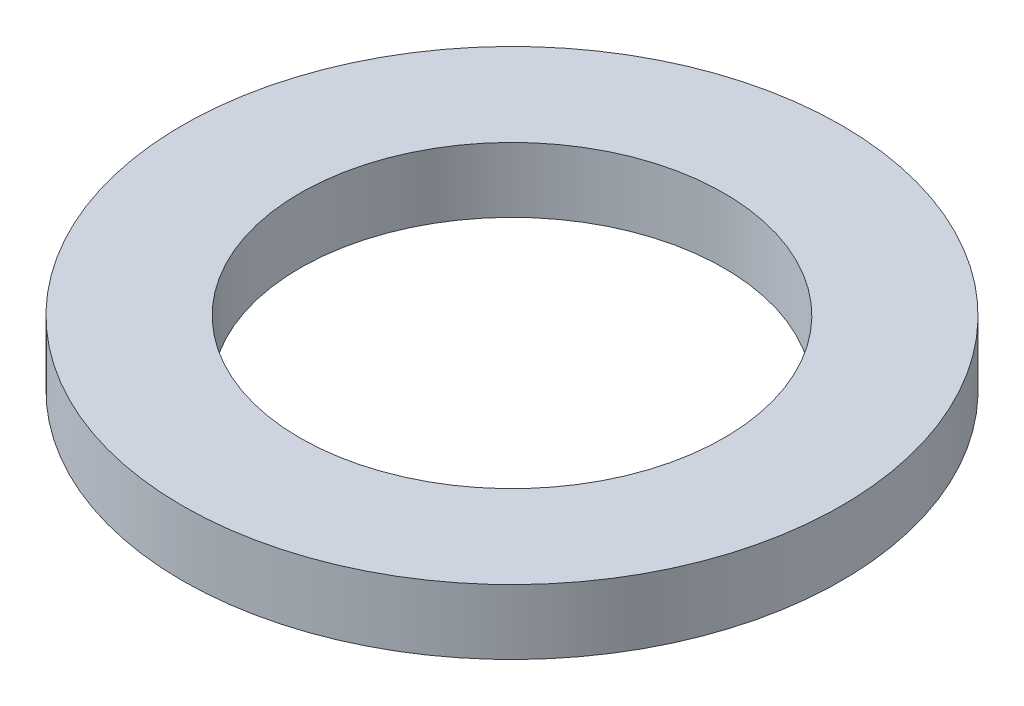
ISO-10303-21;
HEADER;
FILE_DESCRIPTION(('STEP AP214'),'2;1');
FILE_NAME('part.step','',(''),(''),'','','');
FILE_SCHEMA(('AUTOMOTIVE_DESIGN { 1 0 10303 214 1 1 1 1 }'));
ENDSEC;
DATA;
#1=APPLICATION_CONTEXT('core data for automotive mechanical design processes');
#2=APPLICATION_PROTOCOL_DEFINITION('international standard','automotive_design',2000,#1);
#3=PRODUCT_CONTEXT('',#1,'mechanical');
#4=PRODUCT('Part','Part','',(#3));
#5=PRODUCT_RELATED_PRODUCT_CATEGORY('part','',(#4));
#6=PRODUCT_DEFINITION_FORMATION('','',#4);
#7=PRODUCT_DEFINITION_CONTEXT('part definition',#1,'design');
#8=PRODUCT_DEFINITION('design','',#6,#7);
#9=PRODUCT_DEFINITION_SHAPE('','',#8);
#10=(LENGTH_UNIT() NAMED_UNIT(*) SI_UNIT(.MILLI.,.METRE.));
#11=(NAMED_UNIT(*) PLANE_ANGLE_UNIT() SI_UNIT($,.RADIAN.));
#12=(NAMED_UNIT(*) SI_UNIT($,.STERADIAN.) SOLID_ANGLE_UNIT());
#13=UNCERTAINTY_MEASURE_WITH_UNIT(LENGTH_MEASURE(1.E-05),#10,'distance_accuracy_value','');
#14=(GEOMETRIC_REPRESENTATION_CONTEXT(3) GLOBAL_UNCERTAINTY_ASSIGNED_CONTEXT((#13)) GLOBAL_UNIT_ASSIGNED_CONTEXT((#10,
#11,#12)) REPRESENTATION_CONTEXT('',''));
#15=CARTESIAN_POINT('',(0.,0.,0.));
#16=DIRECTION('',(0.,0.,1.));
#17=DIRECTION('',(1.,0.,0.));
#18=AXIS2_PLACEMENT_3D('',#15,#16,#17);
#19=CARTESIAN_POINT('',(0.,6.35,0.));
#20=DIRECTION('',(0.,1.,0.));
#21=DIRECTION('',(0.,0.,1.));
#22=AXIS2_PLACEMENT_3D('',#19,#20,#21);
#23=PLANE('',#22);
#24=CARTESIAN_POINT('',(0.,6.35,0.));
#25=DIRECTION('',(0.,1.,0.));
#26=DIRECTION('',(0.,0.,1.));
#27=AXIS2_PLACEMENT_3D('',#24,#25,#26);
#28=CIRCLE('',#27,32.25);
#29=CARTESIAN_POINT('',(0.,6.35,32.25));
#30=VERTEX_POINT('',#29);
#31=EDGE_CURVE('E10',#30,#30,#28,.T.);
#32=ORIENTED_EDGE('',*,*,#31,.T.);
#33=EDGE_LOOP('',(#32));
#34=FACE_BOUND('',#33,.T.);
#35=CARTESIAN_POINT('',(0.,6.35,0.));
#36=DIRECTION('',(0.,1.,0.));
#37=DIRECTION('',(0.,0.,1.));
#38=AXIS2_PLACEMENT_3D('',#35,#36,#37);
#39=CIRCLE('',#38,20.75);
#40=CARTESIAN_POINT('',(0.,6.35,20.75));
#41=VERTEX_POINT('',#40);
#42=EDGE_CURVE('E50',#41,#41,#39,.T.);
#43=ORIENTED_EDGE('',*,*,#42,.F.);
#44=EDGE_LOOP('',(#43));
#45=FACE_BOUND('',#44,.T.);
#46=ADVANCED_FACE('F37',(#34,#45),#23,.T.);
#47=CARTESIAN_POINT('',(0.,0.,0.));
#48=DIRECTION('',(0.,1.,0.));
#49=DIRECTION('',(0.,0.,1.));
#50=AXIS2_PLACEMENT_3D('',#47,#48,#49);
#51=PLANE('',#50);
#52=CARTESIAN_POINT('',(0.,0.,0.));
#53=DIRECTION('',(0.,1.,0.));
#54=DIRECTION('',(0.,0.,1.));
#55=AXIS2_PLACEMENT_3D('',#52,#53,#54);
#56=CIRCLE('',#55,32.25);
#57=CARTESIAN_POINT('',(0.,0.,32.25));
#58=VERTEX_POINT('',#57);
#59=EDGE_CURVE('E41',#58,#58,#56,.T.);
#60=ORIENTED_EDGE('',*,*,#59,.F.);
#61=EDGE_LOOP('',(#60));
#62=FACE_BOUND('',#61,.T.);
#63=CARTESIAN_POINT('',(0.,0.,0.));
#64=DIRECTION('',(0.,1.,0.));
#65=DIRECTION('',(0.,0.,1.));
#66=AXIS2_PLACEMENT_3D('',#63,#64,#65);
#67=CIRCLE('',#66,20.75);
#68=CARTESIAN_POINT('',(0.,0.,20.75));
#69=VERTEX_POINT('',#68);
#70=EDGE_CURVE('E52',#69,#69,#67,.T.);
#71=ORIENTED_EDGE('',*,*,#70,.T.);
#72=EDGE_LOOP('',(#71));
#73=FACE_BOUND('',#72,.T.);
#74=ADVANCED_FACE('F64',(#62,#73),#51,.F.);
#75=CARTESIAN_POINT('',(0.,6.35,0.));
#76=DIRECTION('',(0.,-1.,0.));
#77=DIRECTION('',(0.,0.,-1.));
#78=AXIS2_PLACEMENT_3D('',#75,#76,#77);
#79=CYLINDRICAL_SURFACE('',#78,32.25);
#80=ORIENTED_EDGE('',*,*,#31,.F.);
#81=EDGE_LOOP('',(#80));
#82=FACE_BOUND('',#81,.T.);
#83=ORIENTED_EDGE('',*,*,#59,.T.);
#84=EDGE_LOOP('',(#83));
#85=FACE_BOUND('',#84,.T.);
#86=ADVANCED_FACE('F39',(#82,#85),#79,.T.);
#87=CARTESIAN_POINT('',(0.,6.35,0.));
#88=DIRECTION('',(0.,-1.,0.));
#89=DIRECTION('',(0.,0.,-1.));
#90=AXIS2_PLACEMENT_3D('',#87,#88,#89);
#91=CYLINDRICAL_SURFACE('',#90,20.75);
#92=ORIENTED_EDGE('',*,*,#42,.T.);
#93=EDGE_LOOP('',(#92));
#94=FACE_BOUND('',#93,.T.);
#95=ORIENTED_EDGE('',*,*,#70,.F.);
#96=EDGE_LOOP('',(#95));
#97=FACE_BOUND('',#96,.T.);
#98=ADVANCED_FACE('F60',(#94,#97),#91,.F.);
#99=CLOSED_SHELL('',(#46,#74,#86,#98));
#100=MANIFOLD_SOLID_BREP('B2',#99);
#101=ADVANCED_BREP_SHAPE_REPRESENTATION('',(#18,#100),#14);
#102=SHAPE_DEFINITION_REPRESENTATION(#9,#101);
ENDSEC;
END-ISO-10303-21;
